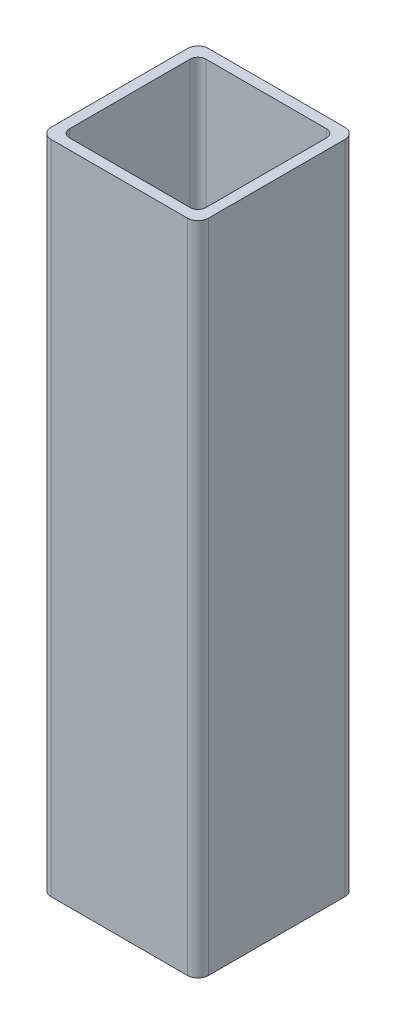
ISO-10303-21;
HEADER;
FILE_DESCRIPTION(('STEP AP214'),'2;1');
FILE_NAME('part.step','',(''),(''),'','','');
FILE_SCHEMA(('AUTOMOTIVE_DESIGN { 1 0 10303 214 1 1 1 1 }'));
ENDSEC;
DATA;
#1=APPLICATION_CONTEXT('core data for automotive mechanical design processes');
#2=APPLICATION_PROTOCOL_DEFINITION('international standard','automotive_design',2000,#1);
#3=PRODUCT_CONTEXT('',#1,'mechanical');
#4=PRODUCT('Part','Part','',(#3));
#5=PRODUCT_RELATED_PRODUCT_CATEGORY('part','',(#4));
#6=PRODUCT_DEFINITION_FORMATION('','',#4);
#7=PRODUCT_DEFINITION_CONTEXT('part definition',#1,'design');
#8=PRODUCT_DEFINITION('design','',#6,#7);
#9=PRODUCT_DEFINITION_SHAPE('','',#8);
#10=(LENGTH_UNIT() NAMED_UNIT(*) SI_UNIT(.MILLI.,.METRE.));
#11=(NAMED_UNIT(*) PLANE_ANGLE_UNIT() SI_UNIT($,.RADIAN.));
#12=(NAMED_UNIT(*) SI_UNIT($,.STERADIAN.) SOLID_ANGLE_UNIT());
#13=UNCERTAINTY_MEASURE_WITH_UNIT(LENGTH_MEASURE(1.E-05),#10,'distance_accuracy_value','');
#14=(GEOMETRIC_REPRESENTATION_CONTEXT(3) GLOBAL_UNCERTAINTY_ASSIGNED_CONTEXT((#13)) GLOBAL_UNIT_ASSIGNED_CONTEXT((#10,
#11,#12)) REPRESENTATION_CONTEXT('',''));
#15=CARTESIAN_POINT('',(0.,0.,0.));
#16=DIRECTION('',(0.,0.,1.));
#17=DIRECTION('',(1.,0.,0.));
#18=AXIS2_PLACEMENT_3D('',#15,#16,#17);
#19=CARTESIAN_POINT('',(-56.,-150.,55.9999999999995));
#20=DIRECTION('',(0.,1.,0.));
#21=DIRECTION('',(0.,0.,1.));
#22=AXIS2_PLACEMENT_3D('',#19,#20,#21);
#23=CYLINDRICAL_SURFACE('',#22,4.);
#24=DIRECTION('',(0.,1.,0.));
#25=VECTOR('',#24,1.);
#26=CARTESIAN_POINT('',(-56.,-150.,59.9999999999995));
#27=LINE('',#26,#25);
#28=CARTESIAN_POINT('',(-56.,-150.,59.9999999999995));
#29=VERTEX_POINT('',#28);
#30=CARTESIAN_POINT('',(-56.,100.,59.9999999999995));
#31=VERTEX_POINT('',#30);
#32=EDGE_CURVE('E38',#29,#31,#27,.T.);
#33=ORIENTED_EDGE('',*,*,#32,.T.);
#34=CARTESIAN_POINT('',(-56.,100.,55.9999999999995));
#35=DIRECTION('',(0.,1.,0.));
#36=DIRECTION('',(0.,0.,1.));
#37=AXIS2_PLACEMENT_3D('',#34,#35,#36);
#38=CIRCLE('',#37,4.);
#39=CARTESIAN_POINT('',(-60.,100.,55.9999999999995));
#40=VERTEX_POINT('',#39);
#41=EDGE_CURVE('E191',#40,#31,#38,.T.);
#42=ORIENTED_EDGE('',*,*,#41,.F.);
#43=DIRECTION('',(0.,1.,0.));
#44=VECTOR('',#43,1.);
#45=CARTESIAN_POINT('',(-60.,-150.,55.9999999999995));
#46=LINE('',#45,#44);
#47=CARTESIAN_POINT('',(-60.,-150.,55.9999999999995));
#48=VERTEX_POINT('',#47);
#49=EDGE_CURVE('E11',#48,#40,#46,.T.);
#50=ORIENTED_EDGE('',*,*,#49,.F.);
#51=CARTESIAN_POINT('',(-56.,-150.,55.9999999999995));
#52=DIRECTION('',(0.,1.,0.));
#53=DIRECTION('',(0.,0.,1.));
#54=AXIS2_PLACEMENT_3D('',#51,#52,#53);
#55=CIRCLE('',#54,4.);
#56=EDGE_CURVE('E234',#48,#29,#55,.T.);
#57=ORIENTED_EDGE('',*,*,#56,.T.);
#58=EDGE_LOOP('',(#33,#42,#50,#57));
#59=FACE_BOUND('',#58,.T.);
#60=ADVANCED_FACE('F35',(#59),#23,.T.);
#61=CARTESIAN_POINT('',(-60.,-150.,3.99999999999955));
#62=DIRECTION('',(-1.,0.,0.));
#63=DIRECTION('',(0.,0.,1.));
#64=AXIS2_PLACEMENT_3D('',#61,#62,#63);
#65=PLANE('',#64);
#66=ORIENTED_EDGE('',*,*,#49,.T.);
#67=DIRECTION('',(0.,0.,1.));
#68=VECTOR('',#67,1.);
#69=CARTESIAN_POINT('',(-60.,100.,3.99999999999955));
#70=LINE('',#69,#68);
#71=CARTESIAN_POINT('',(-60.,100.,3.99999999999955));
#72=VERTEX_POINT('',#71);
#73=EDGE_CURVE('E212',#72,#40,#70,.T.);
#74=ORIENTED_EDGE('',*,*,#73,.F.);
#75=DIRECTION('',(0.,1.,0.));
#76=VECTOR('',#75,1.);
#77=CARTESIAN_POINT('',(-60.,-150.,3.99999999999955));
#78=LINE('',#77,#76);
#79=CARTESIAN_POINT('',(-60.,-150.,3.99999999999955));
#80=VERTEX_POINT('',#79);
#81=EDGE_CURVE('E43',#80,#72,#78,.T.);
#82=ORIENTED_EDGE('',*,*,#81,.F.);
#83=DIRECTION('',(0.,0.,1.));
#84=VECTOR('',#83,1.);
#85=CARTESIAN_POINT('',(-60.,-150.,3.99999999999955));
#86=LINE('',#85,#84);
#87=EDGE_CURVE('E265',#80,#48,#86,.T.);
#88=ORIENTED_EDGE('',*,*,#87,.T.);
#89=EDGE_LOOP('',(#66,#74,#82,#88));
#90=FACE_BOUND('',#89,.T.);
#91=ADVANCED_FACE('F286',(#90),#65,.T.);
#92=CARTESIAN_POINT('',(-56.,-150.,3.99999999999955));
#93=DIRECTION('',(0.,1.,0.));
#94=DIRECTION('',(0.,0.,1.));
#95=AXIS2_PLACEMENT_3D('',#92,#93,#94);
#96=CYLINDRICAL_SURFACE('',#95,4.);
#97=ORIENTED_EDGE('',*,*,#81,.T.);
#98=CARTESIAN_POINT('',(-56.,100.,3.99999999999955));
#99=DIRECTION('',(0.,1.,0.));
#100=DIRECTION('',(0.,0.,1.));
#101=AXIS2_PLACEMENT_3D('',#98,#99,#100);
#102=CIRCLE('',#101,4.);
#103=CARTESIAN_POINT('',(-56.,100.,-4.49293380277993E-13));
#104=VERTEX_POINT('',#103);
#105=EDGE_CURVE('E209',#104,#72,#102,.T.);
#106=ORIENTED_EDGE('',*,*,#105,.F.);
#107=DIRECTION('',(0.,1.,0.));
#108=VECTOR('',#107,1.);
#109=CARTESIAN_POINT('',(-56.,-150.,-4.49293380277993E-13));
#110=LINE('',#109,#108);
#111=CARTESIAN_POINT('',(-56.,-150.,-4.49293380277993E-13));
#112=VERTEX_POINT('',#111);
#113=EDGE_CURVE('E269',#112,#104,#110,.T.);
#114=ORIENTED_EDGE('',*,*,#113,.F.);
#115=CARTESIAN_POINT('',(-56.,-150.,3.99999999999955));
#116=DIRECTION('',(0.,1.,0.));
#117=DIRECTION('',(0.,0.,1.));
#118=AXIS2_PLACEMENT_3D('',#115,#116,#117);
#119=CIRCLE('',#118,4.);
#120=EDGE_CURVE('E262',#112,#80,#119,.T.);
#121=ORIENTED_EDGE('',*,*,#120,.T.);
#122=EDGE_LOOP('',(#97,#106,#114,#121));
#123=FACE_BOUND('',#122,.T.);
#124=ADVANCED_FACE('F307',(#123),#96,.T.);
#125=CARTESIAN_POINT('',(-56.,-150.,-4.5102810375397E-13));
#126=DIRECTION('',(0.,0.,-1.));
#127=DIRECTION('',(-1.,0.,0.));
#128=AXIS2_PLACEMENT_3D('',#125,#126,#127);
#129=PLANE('',#128);
#130=ORIENTED_EDGE('',*,*,#113,.T.);
#131=DIRECTION('',(-1.,0.,0.));
#132=VECTOR('',#131,1.);
#133=CARTESIAN_POINT('',(-56.,100.,-4.5102810375397E-13));
#134=LINE('',#133,#132);
#135=CARTESIAN_POINT('',(-4.,100.,-4.5102810375397E-13));
#136=VERTEX_POINT('',#135);
#137=EDGE_CURVE('E206',#136,#104,#134,.T.);
#138=ORIENTED_EDGE('',*,*,#137,.F.);
#139=DIRECTION('',(0.,1.,0.));
#140=VECTOR('',#139,1.);
#141=CARTESIAN_POINT('',(-4.,-150.,-4.5102810375397E-13));
#142=LINE('',#141,#140);
#143=CARTESIAN_POINT('',(-4.,-150.,-4.5102810375397E-13));
#144=VERTEX_POINT('',#143);
#145=EDGE_CURVE('E271',#144,#136,#142,.T.);
#146=ORIENTED_EDGE('',*,*,#145,.F.);
#147=DIRECTION('',(-1.,0.,0.));
#148=VECTOR('',#147,1.);
#149=CARTESIAN_POINT('',(-56.,-150.,-4.5102810375397E-13));
#150=LINE('',#149,#148);
#151=EDGE_CURVE('E259',#144,#112,#150,.T.);
#152=ORIENTED_EDGE('',*,*,#151,.T.);
#153=EDGE_LOOP('',(#130,#138,#146,#152));
#154=FACE_BOUND('',#153,.T.);
#155=ADVANCED_FACE('F304',(#154),#129,.T.);
#156=CARTESIAN_POINT('',(-4.,-150.,3.99999999999955));
#157=DIRECTION('',(0.,1.,0.));
#158=DIRECTION('',(0.,0.,1.));
#159=AXIS2_PLACEMENT_3D('',#156,#157,#158);
#160=CYLINDRICAL_SURFACE('',#159,4.);
#161=ORIENTED_EDGE('',*,*,#145,.T.);
#162=CARTESIAN_POINT('',(-4.,100.,3.99999999999955));
#163=DIRECTION('',(0.,1.,0.));
#164=DIRECTION('',(0.,0.,-1.));
#165=AXIS2_PLACEMENT_3D('',#162,#163,#164);
#166=CIRCLE('',#165,4.);
#167=CARTESIAN_POINT('',(0.,100.,3.99999999999955));
#168=VERTEX_POINT('',#167);
#169=EDGE_CURVE('E203',#168,#136,#166,.T.);
#170=ORIENTED_EDGE('',*,*,#169,.F.);
#171=DIRECTION('',(0.,1.,0.));
#172=VECTOR('',#171,1.);
#173=CARTESIAN_POINT('',(0.,-150.,3.99999999999955));
#174=LINE('',#173,#172);
#175=CARTESIAN_POINT('',(0.,-150.,3.99999999999955));
#176=VERTEX_POINT('',#175);
#177=EDGE_CURVE('E273',#176,#168,#174,.T.);
#178=ORIENTED_EDGE('',*,*,#177,.F.);
#179=CARTESIAN_POINT('',(-4.,-150.,3.99999999999955));
#180=DIRECTION('',(0.,1.,0.));
#181=DIRECTION('',(0.,0.,-1.));
#182=AXIS2_PLACEMENT_3D('',#179,#180,#181);
#183=CIRCLE('',#182,4.);
#184=EDGE_CURVE('E256',#176,#144,#183,.T.);
#185=ORIENTED_EDGE('',*,*,#184,.T.);
#186=EDGE_LOOP('',(#161,#170,#178,#185));
#187=FACE_BOUND('',#186,.T.);
#188=ADVANCED_FACE('F302',(#187),#160,.T.);
#189=CARTESIAN_POINT('',(0.,-150.,3.99999999999955));
#190=DIRECTION('',(1.,0.,0.));
#191=DIRECTION('',(0.,0.,-1.));
#192=AXIS2_PLACEMENT_3D('',#189,#190,#191);
#193=PLANE('',#192);
#194=ORIENTED_EDGE('',*,*,#177,.T.);
#195=DIRECTION('',(0.,0.,-1.));
#196=VECTOR('',#195,1.);
#197=CARTESIAN_POINT('',(0.,100.,3.99999999999955));
#198=LINE('',#197,#196);
#199=CARTESIAN_POINT('',(0.,100.,55.9999999999995));
#200=VERTEX_POINT('',#199);
#201=EDGE_CURVE('E200',#200,#168,#198,.T.);
#202=ORIENTED_EDGE('',*,*,#201,.F.);
#203=DIRECTION('',(0.,1.,0.));
#204=VECTOR('',#203,1.);
#205=CARTESIAN_POINT('',(0.,-150.,55.9999999999995));
#206=LINE('',#205,#204);
#207=CARTESIAN_POINT('',(0.,-150.,55.9999999999995));
#208=VERTEX_POINT('',#207);
#209=EDGE_CURVE('E275',#208,#200,#206,.T.);
#210=ORIENTED_EDGE('',*,*,#209,.F.);
#211=DIRECTION('',(0.,0.,-1.));
#212=VECTOR('',#211,1.);
#213=CARTESIAN_POINT('',(0.,-150.,3.99999999999955));
#214=LINE('',#213,#212);
#215=EDGE_CURVE('E253',#208,#176,#214,.T.);
#216=ORIENTED_EDGE('',*,*,#215,.T.);
#217=EDGE_LOOP('',(#194,#202,#210,#216));
#218=FACE_BOUND('',#217,.T.);
#219=ADVANCED_FACE('F300',(#218),#193,.T.);
#220=CARTESIAN_POINT('',(-4.,-150.,55.9999999999995));
#221=DIRECTION('',(0.,1.,0.));
#222=DIRECTION('',(0.,0.,1.));
#223=AXIS2_PLACEMENT_3D('',#220,#221,#222);
#224=CYLINDRICAL_SURFACE('',#223,4.);
#225=ORIENTED_EDGE('',*,*,#209,.T.);
#226=CARTESIAN_POINT('',(-4.,100.,55.9999999999995));
#227=DIRECTION('',(0.,1.,0.));
#228=DIRECTION('',(0.,0.,1.));
#229=AXIS2_PLACEMENT_3D('',#226,#227,#228);
#230=CIRCLE('',#229,4.);
#231=CARTESIAN_POINT('',(-4.,100.,59.9999999999995));
#232=VERTEX_POINT('',#231);
#233=EDGE_CURVE('E197',#232,#200,#230,.T.);
#234=ORIENTED_EDGE('',*,*,#233,.F.);
#235=DIRECTION('',(0.,1.,0.));
#236=VECTOR('',#235,1.);
#237=CARTESIAN_POINT('',(-4.,-150.,59.9999999999995));
#238=LINE('',#237,#236);
#239=CARTESIAN_POINT('',(-4.,-150.,59.9999999999995));
#240=VERTEX_POINT('',#239);
#241=EDGE_CURVE('E276',#240,#232,#238,.T.);
#242=ORIENTED_EDGE('',*,*,#241,.F.);
#243=CARTESIAN_POINT('',(-4.,-150.,55.9999999999995));
#244=DIRECTION('',(0.,1.,0.));
#245=DIRECTION('',(0.,0.,1.));
#246=AXIS2_PLACEMENT_3D('',#243,#244,#245);
#247=CIRCLE('',#246,4.);
#248=EDGE_CURVE('E250',#240,#208,#247,.T.);
#249=ORIENTED_EDGE('',*,*,#248,.T.);
#250=EDGE_LOOP('',(#225,#234,#242,#249));
#251=FACE_BOUND('',#250,.T.);
#252=ADVANCED_FACE('F296',(#251),#224,.T.);
#253=CARTESIAN_POINT('',(-56.,-150.,59.9999999999995));
#254=DIRECTION('',(0.,0.,1.));
#255=DIRECTION('',(1.,0.,0.));
#256=AXIS2_PLACEMENT_3D('',#253,#254,#255);
#257=PLANE('',#256);
#258=ORIENTED_EDGE('',*,*,#241,.T.);
#259=DIRECTION('',(1.,0.,0.));
#260=VECTOR('',#259,1.);
#261=CARTESIAN_POINT('',(-56.,100.,59.9999999999995));
#262=LINE('',#261,#260);
#263=EDGE_CURVE('E194',#31,#232,#262,.T.);
#264=ORIENTED_EDGE('',*,*,#263,.F.);
#265=ORIENTED_EDGE('',*,*,#32,.F.);
#266=DIRECTION('',(1.,0.,0.));
#267=VECTOR('',#266,1.);
#268=CARTESIAN_POINT('',(-56.,-150.,59.9999999999995));
#269=LINE('',#268,#267);
#270=EDGE_CURVE('E247',#29,#240,#269,.T.);
#271=ORIENTED_EDGE('',*,*,#270,.T.);
#272=EDGE_LOOP('',(#258,#264,#265,#271));
#273=FACE_BOUND('',#272,.T.);
#274=ADVANCED_FACE('F280',(#273),#257,.T.);
#275=CARTESIAN_POINT('',(-56.,-150.,55.9999999999995));
#276=DIRECTION('',(0.,1.,0.));
#277=DIRECTION('',(0.,0.,1.));
#278=AXIS2_PLACEMENT_3D('',#275,#276,#277);
#279=PLANE('',#278);
#280=DIRECTION('',(0.,0.,1.));
#281=VECTOR('',#280,1.);
#282=CARTESIAN_POINT('',(-56.,-150.,6.99999999999953));
#283=LINE('',#282,#281);
#284=CARTESIAN_POINT('',(-56.,-150.,6.99999999999953));
#285=VERTEX_POINT('',#284);
#286=CARTESIAN_POINT('',(-56.,-150.,52.9999999999996));
#287=VERTEX_POINT('',#286);
#288=EDGE_CURVE('E160',#285,#287,#283,.T.);
#289=ORIENTED_EDGE('',*,*,#288,.T.);
#290=CARTESIAN_POINT('',(-53.,-150.,52.9999999999996));
#291=DIRECTION('',(0.,1.,0.));
#292=DIRECTION('',(0.,0.,1.));
#293=AXIS2_PLACEMENT_3D('',#290,#291,#292);
#294=CIRCLE('',#293,2.99999999999999);
#295=CARTESIAN_POINT('',(-53.,-150.,55.9999999999996));
#296=VERTEX_POINT('',#295);
#297=EDGE_CURVE('E215',#287,#296,#294,.T.);
#298=ORIENTED_EDGE('',*,*,#297,.T.);
#299=DIRECTION('',(1.,0.,0.));
#300=VECTOR('',#299,1.);
#301=CARTESIAN_POINT('',(-53.,-150.,55.9999999999996));
#302=LINE('',#301,#300);
#303=CARTESIAN_POINT('',(-7.,-150.,55.9999999999996));
#304=VERTEX_POINT('',#303);
#305=EDGE_CURVE('E155',#296,#304,#302,.T.);
#306=ORIENTED_EDGE('',*,*,#305,.T.);
#307=CARTESIAN_POINT('',(-7.,-150.,52.9999999999996));
#308=DIRECTION('',(0.,1.,0.));
#309=DIRECTION('',(0.,0.,1.));
#310=AXIS2_PLACEMENT_3D('',#307,#308,#309);
#311=CIRCLE('',#310,2.99999999999999);
#312=CARTESIAN_POINT('',(-4.00000000000001,-150.,52.9999999999996));
#313=VERTEX_POINT('',#312);
#314=EDGE_CURVE('E51',#304,#313,#311,.T.);
#315=ORIENTED_EDGE('',*,*,#314,.T.);
#316=DIRECTION('',(0.,0.,-1.));
#317=VECTOR('',#316,1.);
#318=CARTESIAN_POINT('',(-4.00000000000001,-150.,6.99999999999953));
#319=LINE('',#318,#317);
#320=CARTESIAN_POINT('',(-4.,-150.,6.99999999999953));
#321=VERTEX_POINT('',#320);
#322=EDGE_CURVE('E219',#313,#321,#319,.T.);
#323=ORIENTED_EDGE('',*,*,#322,.T.);
#324=CARTESIAN_POINT('',(-7.,-150.,6.99999999999953));
#325=DIRECTION('',(0.,1.,0.));
#326=DIRECTION('',(0.,0.,-1.));
#327=AXIS2_PLACEMENT_3D('',#324,#325,#326);
#328=CIRCLE('',#327,3.);
#329=CARTESIAN_POINT('',(-7.,-150.,3.99999999999954));
#330=VERTEX_POINT('',#329);
#331=EDGE_CURVE('E222',#321,#330,#328,.T.);
#332=ORIENTED_EDGE('',*,*,#331,.T.);
#333=DIRECTION('',(-1.,0.,0.));
#334=VECTOR('',#333,1.);
#335=CARTESIAN_POINT('',(-53.,-150.,3.99999999999954));
#336=LINE('',#335,#334);
#337=CARTESIAN_POINT('',(-53.,-150.,3.99999999999954));
#338=VERTEX_POINT('',#337);
#339=EDGE_CURVE('E225',#330,#338,#336,.T.);
#340=ORIENTED_EDGE('',*,*,#339,.T.);
#341=CARTESIAN_POINT('',(-53.,-150.,6.99999999999953));
#342=DIRECTION('',(0.,1.,0.));
#343=DIRECTION('',(0.,0.,1.));
#344=AXIS2_PLACEMENT_3D('',#341,#342,#343);
#345=CIRCLE('',#344,3.);
#346=EDGE_CURVE('E228',#338,#285,#345,.T.);
#347=ORIENTED_EDGE('',*,*,#346,.T.);
#348=EDGE_LOOP('',(#289,#298,#306,#315,#323,#332,#340,#347));
#349=FACE_BOUND('',#348,.T.);
#350=ORIENTED_EDGE('',*,*,#56,.F.);
#351=ORIENTED_EDGE('',*,*,#87,.F.);
#352=ORIENTED_EDGE('',*,*,#120,.F.);
#353=ORIENTED_EDGE('',*,*,#151,.F.);
#354=ORIENTED_EDGE('',*,*,#184,.F.);
#355=ORIENTED_EDGE('',*,*,#215,.F.);
#356=ORIENTED_EDGE('',*,*,#248,.F.);
#357=ORIENTED_EDGE('',*,*,#270,.F.);
#358=EDGE_LOOP('',(#350,#351,#352,#353,#354,#355,#356,#357));
#359=FACE_BOUND('',#358,.T.);
#360=ADVANCED_FACE('F290',(#349,#359),#279,.F.);
#361=CARTESIAN_POINT('',(-53.,-150.,52.9999999999996));
#362=DIRECTION('',(0.,1.,0.));
#363=DIRECTION('',(0.,0.,1.));
#364=AXIS2_PLACEMENT_3D('',#361,#362,#363);
#365=CYLINDRICAL_SURFACE('',#364,2.99999999999999);
#366=DIRECTION('',(0.,1.,0.));
#367=VECTOR('',#366,1.);
#368=CARTESIAN_POINT('',(-56.,-150.,52.9999999999996));
#369=LINE('',#368,#367);
#370=CARTESIAN_POINT('',(-56.,100.,52.9999999999996));
#371=VERTEX_POINT('',#370);
#372=EDGE_CURVE('E165',#287,#371,#369,.T.);
#373=ORIENTED_EDGE('',*,*,#372,.T.);
#374=CARTESIAN_POINT('',(-53.,100.,52.9999999999996));
#375=DIRECTION('',(0.,1.,0.));
#376=DIRECTION('',(0.,0.,1.));
#377=AXIS2_PLACEMENT_3D('',#374,#375,#376);
#378=CIRCLE('',#377,2.99999999999999);
#379=CARTESIAN_POINT('',(-53.,100.,55.9999999999996));
#380=VERTEX_POINT('',#379);
#381=EDGE_CURVE('E163',#371,#380,#378,.T.);
#382=ORIENTED_EDGE('',*,*,#381,.T.);
#383=DIRECTION('',(0.,1.,0.));
#384=VECTOR('',#383,1.);
#385=CARTESIAN_POINT('',(-53.,-150.,55.9999999999996));
#386=LINE('',#385,#384);
#387=EDGE_CURVE('E148',#296,#380,#386,.T.);
#388=ORIENTED_EDGE('',*,*,#387,.F.);
#389=ORIENTED_EDGE('',*,*,#297,.F.);
#390=EDGE_LOOP('',(#373,#382,#388,#389));
#391=FACE_BOUND('',#390,.T.);
#392=ADVANCED_FACE('F164',(#391),#365,.F.);
#393=CARTESIAN_POINT('',(-56.,-150.,6.99999999999953));
#394=DIRECTION('',(-1.,0.,0.));
#395=DIRECTION('',(0.,0.,1.));
#396=AXIS2_PLACEMENT_3D('',#393,#394,#395);
#397=PLANE('',#396);
#398=DIRECTION('',(0.,1.,0.));
#399=VECTOR('',#398,1.);
#400=CARTESIAN_POINT('',(-56.,-150.,6.99999999999953));
#401=LINE('',#400,#399);
#402=CARTESIAN_POINT('',(-56.,100.,6.99999999999953));
#403=VERTEX_POINT('',#402);
#404=EDGE_CURVE('E235',#285,#403,#401,.T.);
#405=ORIENTED_EDGE('',*,*,#404,.T.);
#406=DIRECTION('',(0.,0.,1.));
#407=VECTOR('',#406,1.);
#408=CARTESIAN_POINT('',(-56.,100.,6.99999999999953));
#409=LINE('',#408,#407);
#410=EDGE_CURVE('E189',#403,#371,#409,.T.);
#411=ORIENTED_EDGE('',*,*,#410,.T.);
#412=ORIENTED_EDGE('',*,*,#372,.F.);
#413=ORIENTED_EDGE('',*,*,#288,.F.);
#414=EDGE_LOOP('',(#405,#411,#412,#413));
#415=FACE_BOUND('',#414,.T.);
#416=ADVANCED_FACE('F382',(#415),#397,.F.);
#417=CARTESIAN_POINT('',(-53.,-150.,6.99999999999953));
#418=DIRECTION('',(0.,1.,0.));
#419=DIRECTION('',(0.,0.,1.));
#420=AXIS2_PLACEMENT_3D('',#417,#418,#419);
#421=CYLINDRICAL_SURFACE('',#420,3.);
#422=DIRECTION('',(0.,1.,0.));
#423=VECTOR('',#422,1.);
#424=CARTESIAN_POINT('',(-53.,-150.,3.99999999999954));
#425=LINE('',#424,#423);
#426=CARTESIAN_POINT('',(-53.,100.,3.99999999999954));
#427=VERTEX_POINT('',#426);
#428=EDGE_CURVE('E237',#338,#427,#425,.T.);
#429=ORIENTED_EDGE('',*,*,#428,.T.);
#430=CARTESIAN_POINT('',(-53.,100.,6.99999999999953));
#431=DIRECTION('',(0.,1.,0.));
#432=DIRECTION('',(0.,0.,1.));
#433=AXIS2_PLACEMENT_3D('',#430,#431,#432);
#434=CIRCLE('',#433,3.);
#435=EDGE_CURVE('E186',#427,#403,#434,.T.);
#436=ORIENTED_EDGE('',*,*,#435,.T.);
#437=ORIENTED_EDGE('',*,*,#404,.F.);
#438=ORIENTED_EDGE('',*,*,#346,.F.);
#439=EDGE_LOOP('',(#429,#436,#437,#438));
#440=FACE_BOUND('',#439,.T.);
#441=ADVANCED_FACE('F391',(#440),#421,.F.);
#442=CARTESIAN_POINT('',(-53.,-150.,3.99999999999954));
#443=DIRECTION('',(0.,0.,-1.));
#444=DIRECTION('',(-1.,0.,0.));
#445=AXIS2_PLACEMENT_3D('',#442,#443,#444);
#446=PLANE('',#445);
#447=DIRECTION('',(0.,1.,0.));
#448=VECTOR('',#447,1.);
#449=CARTESIAN_POINT('',(-7.,-150.,3.99999999999954));
#450=LINE('',#449,#448);
#451=CARTESIAN_POINT('',(-7.,100.,3.99999999999954));
#452=VERTEX_POINT('',#451);
#453=EDGE_CURVE('E239',#330,#452,#450,.T.);
#454=ORIENTED_EDGE('',*,*,#453,.T.);
#455=DIRECTION('',(-1.,0.,0.));
#456=VECTOR('',#455,1.);
#457=CARTESIAN_POINT('',(-53.,100.,3.99999999999954));
#458=LINE('',#457,#456);
#459=EDGE_CURVE('E183',#452,#427,#458,.T.);
#460=ORIENTED_EDGE('',*,*,#459,.T.);
#461=ORIENTED_EDGE('',*,*,#428,.F.);
#462=ORIENTED_EDGE('',*,*,#339,.F.);
#463=EDGE_LOOP('',(#454,#460,#461,#462));
#464=FACE_BOUND('',#463,.T.);
#465=ADVANCED_FACE('F401',(#464),#446,.F.);
#466=CARTESIAN_POINT('',(-7.,-150.,6.99999999999953));
#467=DIRECTION('',(0.,1.,0.));
#468=DIRECTION('',(0.,0.,1.));
#469=AXIS2_PLACEMENT_3D('',#466,#467,#468);
#470=CYLINDRICAL_SURFACE('',#469,3.);
#471=DIRECTION('',(0.,1.,0.));
#472=VECTOR('',#471,1.);
#473=CARTESIAN_POINT('',(-4.,-150.,6.99999999999953));
#474=LINE('',#473,#472);
#475=CARTESIAN_POINT('',(-4.,100.,6.99999999999953));
#476=VERTEX_POINT('',#475);
#477=EDGE_CURVE('E241',#321,#476,#474,.T.);
#478=ORIENTED_EDGE('',*,*,#477,.T.);
#479=CARTESIAN_POINT('',(-7.,100.,6.99999999999953));
#480=DIRECTION('',(0.,1.,0.));
#481=DIRECTION('',(0.,0.,-1.));
#482=AXIS2_PLACEMENT_3D('',#479,#480,#481);
#483=CIRCLE('',#482,3.);
#484=EDGE_CURVE('E180',#476,#452,#483,.T.);
#485=ORIENTED_EDGE('',*,*,#484,.T.);
#486=ORIENTED_EDGE('',*,*,#453,.F.);
#487=ORIENTED_EDGE('',*,*,#331,.F.);
#488=EDGE_LOOP('',(#478,#485,#486,#487));
#489=FACE_BOUND('',#488,.T.);
#490=ADVANCED_FACE('F411',(#489),#470,.F.);
#491=CARTESIAN_POINT('',(-4.00000000000001,-150.,6.99999999999953));
#492=DIRECTION('',(1.,0.,0.));
#493=DIRECTION('',(0.,0.,-1.));
#494=AXIS2_PLACEMENT_3D('',#491,#492,#493);
#495=PLANE('',#494);
#496=DIRECTION('',(0.,1.,0.));
#497=VECTOR('',#496,1.);
#498=CARTESIAN_POINT('',(-4.00000000000001,-150.,52.9999999999996));
#499=LINE('',#498,#497);
#500=CARTESIAN_POINT('',(-4.00000000000001,100.,52.9999999999996));
#501=VERTEX_POINT('',#500);
#502=EDGE_CURVE('E243',#313,#501,#499,.T.);
#503=ORIENTED_EDGE('',*,*,#502,.T.);
#504=DIRECTION('',(0.,0.,-1.));
#505=VECTOR('',#504,1.);
#506=CARTESIAN_POINT('',(-4.00000000000001,100.,6.99999999999953));
#507=LINE('',#506,#505);
#508=EDGE_CURVE('E175',#501,#476,#507,.T.);
#509=ORIENTED_EDGE('',*,*,#508,.T.);
#510=ORIENTED_EDGE('',*,*,#477,.F.);
#511=ORIENTED_EDGE('',*,*,#322,.F.);
#512=EDGE_LOOP('',(#503,#509,#510,#511));
#513=FACE_BOUND('',#512,.T.);
#514=ADVANCED_FACE('F421',(#513),#495,.F.);
#515=CARTESIAN_POINT('',(-7.,-150.,52.9999999999996));
#516=DIRECTION('',(0.,1.,0.));
#517=DIRECTION('',(0.,0.,1.));
#518=AXIS2_PLACEMENT_3D('',#515,#516,#517);
#519=CYLINDRICAL_SURFACE('',#518,2.99999999999999);
#520=DIRECTION('',(0.,1.,0.));
#521=VECTOR('',#520,1.);
#522=CARTESIAN_POINT('',(-7.,-150.,55.9999999999996));
#523=LINE('',#522,#521);
#524=CARTESIAN_POINT('',(-7.,100.,55.9999999999996));
#525=VERTEX_POINT('',#524);
#526=EDGE_CURVE('E159',#304,#525,#523,.T.);
#527=ORIENTED_EDGE('',*,*,#526,.T.);
#528=CARTESIAN_POINT('',(-7.,100.,52.9999999999996));
#529=DIRECTION('',(0.,1.,0.));
#530=DIRECTION('',(0.,0.,1.));
#531=AXIS2_PLACEMENT_3D('',#528,#529,#530);
#532=CIRCLE('',#531,2.99999999999999);
#533=EDGE_CURVE('E173',#525,#501,#532,.T.);
#534=ORIENTED_EDGE('',*,*,#533,.T.);
#535=ORIENTED_EDGE('',*,*,#502,.F.);
#536=ORIENTED_EDGE('',*,*,#314,.F.);
#537=EDGE_LOOP('',(#527,#534,#535,#536));
#538=FACE_BOUND('',#537,.T.);
#539=ADVANCED_FACE('F431',(#538),#519,.F.);
#540=CARTESIAN_POINT('',(-53.,-150.,55.9999999999996));
#541=DIRECTION('',(0.,0.,1.));
#542=DIRECTION('',(1.,0.,0.));
#543=AXIS2_PLACEMENT_3D('',#540,#541,#542);
#544=PLANE('',#543);
#545=ORIENTED_EDGE('',*,*,#387,.T.);
#546=DIRECTION('',(1.,0.,0.));
#547=VECTOR('',#546,1.);
#548=CARTESIAN_POINT('',(-53.,100.,55.9999999999996));
#549=LINE('',#548,#547);
#550=EDGE_CURVE('E152',#380,#525,#549,.T.);
#551=ORIENTED_EDGE('',*,*,#550,.T.);
#552=ORIENTED_EDGE('',*,*,#526,.F.);
#553=ORIENTED_EDGE('',*,*,#305,.F.);
#554=EDGE_LOOP('',(#545,#551,#552,#553));
#555=FACE_BOUND('',#554,.T.);
#556=ADVANCED_FACE('F150',(#555),#544,.F.);
#557=CARTESIAN_POINT('',(-56.,100.,55.9999999999995));
#558=DIRECTION('',(0.,1.,0.));
#559=DIRECTION('',(0.,0.,1.));
#560=AXIS2_PLACEMENT_3D('',#557,#558,#559);
#561=PLANE('',#560);
#562=ORIENTED_EDGE('',*,*,#41,.T.);
#563=ORIENTED_EDGE('',*,*,#263,.T.);
#564=ORIENTED_EDGE('',*,*,#233,.T.);
#565=ORIENTED_EDGE('',*,*,#201,.T.);
#566=ORIENTED_EDGE('',*,*,#169,.T.);
#567=ORIENTED_EDGE('',*,*,#137,.T.);
#568=ORIENTED_EDGE('',*,*,#105,.T.);
#569=ORIENTED_EDGE('',*,*,#73,.T.);
#570=EDGE_LOOP('',(#562,#563,#564,#565,#566,#567,#568,#569));
#571=FACE_BOUND('',#570,.T.);
#572=ORIENTED_EDGE('',*,*,#550,.F.);
#573=ORIENTED_EDGE('',*,*,#381,.F.);
#574=ORIENTED_EDGE('',*,*,#410,.F.);
#575=ORIENTED_EDGE('',*,*,#435,.F.);
#576=ORIENTED_EDGE('',*,*,#459,.F.);
#577=ORIENTED_EDGE('',*,*,#484,.F.);
#578=ORIENTED_EDGE('',*,*,#508,.F.);
#579=ORIENTED_EDGE('',*,*,#533,.F.);
#580=EDGE_LOOP('',(#572,#573,#574,#575,#576,#577,#578,#579));
#581=FACE_BOUND('',#580,.T.);
#582=ADVANCED_FACE('F170',(#571,#581),#561,.T.);
#583=CLOSED_SHELL('',(#60,#91,#124,#155,#188,#219,#252,#274,#360,#392,#416,#441,#465,#490,#514,
#539,#556,#582));
#584=MANIFOLD_SOLID_BREP('B2',#583);
#585=ADVANCED_BREP_SHAPE_REPRESENTATION('',(#18,#584),#14);
#586=SHAPE_DEFINITION_REPRESENTATION(#9,#585);
ENDSEC;
END-ISO-10303-21;
